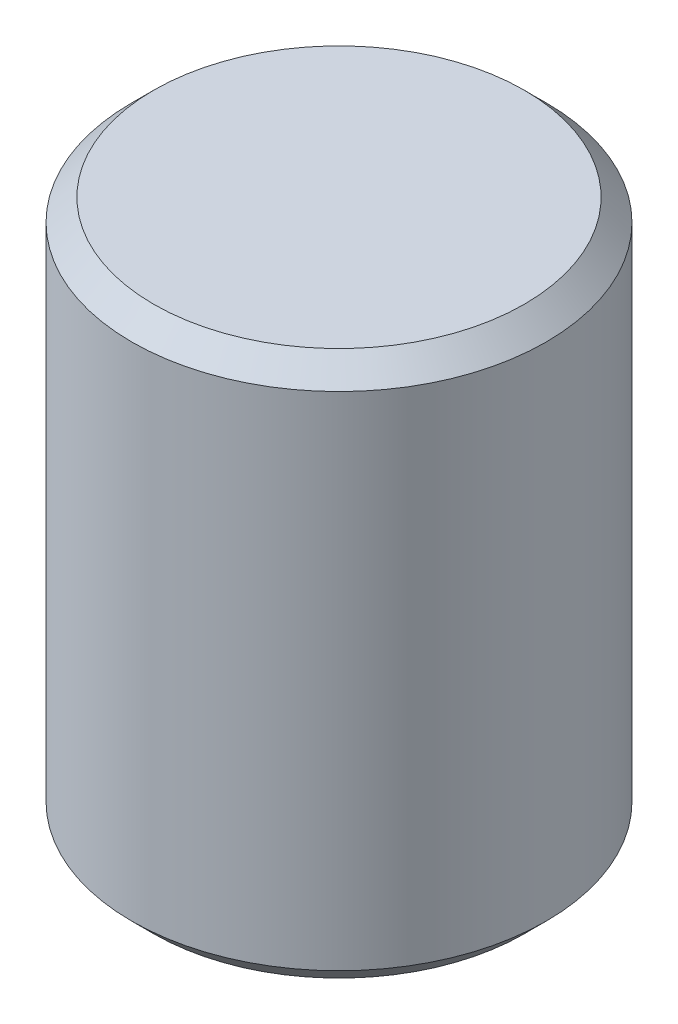
ISO-10303-21;
HEADER;
FILE_DESCRIPTION(('STEP AP214'),'2;1');
FILE_NAME('part.step','',(''),(''),'','','');
FILE_SCHEMA(('AUTOMOTIVE_DESIGN { 1 0 10303 214 1 1 1 1 }'));
ENDSEC;
DATA;
#1=APPLICATION_CONTEXT('core data for automotive mechanical design processes');
#2=APPLICATION_PROTOCOL_DEFINITION('international standard','automotive_design',2000,#1);
#3=PRODUCT_CONTEXT('',#1,'mechanical');
#4=PRODUCT('Part','Part','',(#3));
#5=PRODUCT_RELATED_PRODUCT_CATEGORY('part','',(#4));
#6=PRODUCT_DEFINITION_FORMATION('','',#4);
#7=PRODUCT_DEFINITION_CONTEXT('part definition',#1,'design');
#8=PRODUCT_DEFINITION('design','',#6,#7);
#9=PRODUCT_DEFINITION_SHAPE('','',#8);
#10=(LENGTH_UNIT() NAMED_UNIT(*) SI_UNIT(.MILLI.,.METRE.));
#11=(NAMED_UNIT(*) PLANE_ANGLE_UNIT() SI_UNIT($,.RADIAN.));
#12=(NAMED_UNIT(*) SI_UNIT($,.STERADIAN.) SOLID_ANGLE_UNIT());
#13=UNCERTAINTY_MEASURE_WITH_UNIT(LENGTH_MEASURE(1.E-05),#10,'distance_accuracy_value','');
#14=(GEOMETRIC_REPRESENTATION_CONTEXT(3) GLOBAL_UNCERTAINTY_ASSIGNED_CONTEXT((#13)) GLOBAL_UNIT_ASSIGNED_CONTEXT((#10,
#11,#12)) REPRESENTATION_CONTEXT('',''));
#15=CARTESIAN_POINT('',(0.,0.,0.));
#16=DIRECTION('',(0.,0.,1.));
#17=DIRECTION('',(1.,0.,0.));
#18=AXIS2_PLACEMENT_3D('',#15,#16,#17);
#19=CARTESIAN_POINT('',(0.,25.,0.));
#20=DIRECTION('',(0.,-1.,0.));
#21=DIRECTION('',(0.,0.,-1.));
#22=AXIS2_PLACEMENT_3D('',#19,#20,#21);
#23=CYLINDRICAL_SURFACE('',#22,9.5);
#24=CARTESIAN_POINT('',(0.,1.,0.));
#25=DIRECTION('',(0.,1.,0.));
#26=DIRECTION('',(0.,0.,1.));
#27=AXIS2_PLACEMENT_3D('',#24,#25,#26);
#28=CIRCLE('',#27,9.5);
#29=CARTESIAN_POINT('',(0.,1.,9.5));
#30=VERTEX_POINT('',#29);
#31=EDGE_CURVE('E42',#30,#30,#28,.T.);
#32=ORIENTED_EDGE('',*,*,#31,.T.);
#33=EDGE_LOOP('',(#32));
#34=FACE_BOUND('',#33,.T.);
#35=CARTESIAN_POINT('',(0.,24.,0.));
#36=DIRECTION('',(0.,1.,0.));
#37=DIRECTION('',(0.,0.,1.));
#38=AXIS2_PLACEMENT_3D('',#35,#36,#37);
#39=CIRCLE('',#38,9.5);
#40=CARTESIAN_POINT('',(0.,24.,9.5));
#41=VERTEX_POINT('',#40);
#42=EDGE_CURVE('E46',#41,#41,#39,.F.);
#43=ORIENTED_EDGE('',*,*,#42,.T.);
#44=EDGE_LOOP('',(#43));
#45=FACE_BOUND('',#44,.T.);
#46=ADVANCED_FACE('F31',(#34,#45),#23,.T.);
#47=CARTESIAN_POINT('',(0.,25.,0.));
#48=DIRECTION('',(0.,1.,0.));
#49=DIRECTION('',(0.,0.,1.));
#50=AXIS2_PLACEMENT_3D('',#47,#48,#49);
#51=PLANE('',#50);
#52=CARTESIAN_POINT('',(0.,25.,0.));
#53=DIRECTION('',(0.,1.,0.));
#54=DIRECTION('',(0.,0.,1.));
#55=AXIS2_PLACEMENT_3D('',#52,#53,#54);
#56=CIRCLE('',#55,8.49999999999999);
#57=CARTESIAN_POINT('',(0.,25.,8.49999999999999));
#58=VERTEX_POINT('',#57);
#59=EDGE_CURVE('E10',#58,#58,#56,.T.);
#60=ORIENTED_EDGE('',*,*,#59,.T.);
#61=EDGE_LOOP('',(#60));
#62=FACE_BOUND('',#61,.T.);
#63=ADVANCED_FACE('F62',(#62),#51,.T.);
#64=CARTESIAN_POINT('',(0.,0.,0.));
#65=DIRECTION('',(0.,1.,0.));
#66=DIRECTION('',(0.,0.,1.));
#67=AXIS2_PLACEMENT_3D('',#64,#65,#66);
#68=PLANE('',#67);
#69=CARTESIAN_POINT('',(0.,0.,0.));
#70=DIRECTION('',(0.,1.,0.));
#71=DIRECTION('',(0.,0.,1.));
#72=AXIS2_PLACEMENT_3D('',#69,#70,#71);
#73=CIRCLE('',#72,8.49999999999999);
#74=CARTESIAN_POINT('',(0.,0.,8.49999999999999));
#75=VERTEX_POINT('',#74);
#76=EDGE_CURVE('E38',#75,#75,#73,.F.);
#77=ORIENTED_EDGE('',*,*,#76,.T.);
#78=EDGE_LOOP('',(#77));
#79=FACE_BOUND('',#78,.T.);
#80=ADVANCED_FACE('F59',(#79),#68,.F.);
#81=CARTESIAN_POINT('',(0.,1.,0.));
#82=DIRECTION('',(0.,1.,0.));
#83=DIRECTION('',(0.,0.,1.));
#84=AXIS2_PLACEMENT_3D('',#81,#82,#83);
#85=CONICAL_SURFACE('',#84,9.5,0.785398163397449);
#86=ORIENTED_EDGE('',*,*,#76,.F.);
#87=EDGE_LOOP('',(#86));
#88=FACE_BOUND('',#87,.T.);
#89=ORIENTED_EDGE('',*,*,#31,.F.);
#90=EDGE_LOOP('',(#89));
#91=FACE_BOUND('',#90,.T.);
#92=ADVANCED_FACE('F55',(#88,#91),#85,.T.);
#93=CARTESIAN_POINT('',(0.,25.,0.));
#94=DIRECTION('',(0.,-1.,0.));
#95=DIRECTION('',(0.,0.,-1.));
#96=AXIS2_PLACEMENT_3D('',#93,#94,#95);
#97=CONICAL_SURFACE('',#96,8.49999999999999,0.785398163397449);
#98=ORIENTED_EDGE('',*,*,#42,.F.);
#99=EDGE_LOOP('',(#98));
#100=FACE_BOUND('',#99,.T.);
#101=ORIENTED_EDGE('',*,*,#59,.F.);
#102=EDGE_LOOP('',(#101));
#103=FACE_BOUND('',#102,.T.);
#104=ADVANCED_FACE('F33',(#100,#103),#97,.T.);
#105=CLOSED_SHELL('',(#46,#63,#80,#92,#104));
#106=MANIFOLD_SOLID_BREP('B2',#105);
#107=ADVANCED_BREP_SHAPE_REPRESENTATION('',(#18,#106),#14);
#108=SHAPE_DEFINITION_REPRESENTATION(#9,#107);
ENDSEC;
END-ISO-10303-21;
